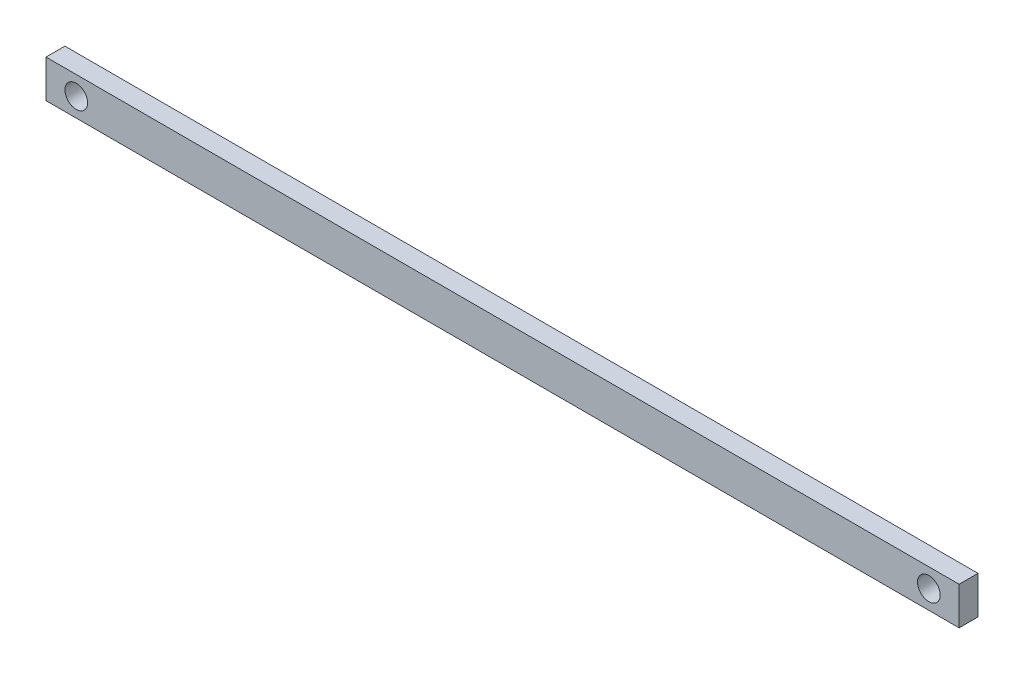
ISO-10303-21;
HEADER;
FILE_DESCRIPTION(('STEP AP214'),'2;1');
FILE_NAME('part.step','',(''),(''),'','','');
FILE_SCHEMA(('AUTOMOTIVE_DESIGN { 1 0 10303 214 1 1 1 1 }'));
ENDSEC;
DATA;
#1=APPLICATION_CONTEXT('core data for automotive mechanical design processes');
#2=APPLICATION_PROTOCOL_DEFINITION('international standard','automotive_design',2000,#1);
#3=PRODUCT_CONTEXT('',#1,'mechanical');
#4=PRODUCT('Part','Part','',(#3));
#5=PRODUCT_RELATED_PRODUCT_CATEGORY('part','',(#4));
#6=PRODUCT_DEFINITION_FORMATION('','',#4);
#7=PRODUCT_DEFINITION_CONTEXT('part definition',#1,'design');
#8=PRODUCT_DEFINITION('design','',#6,#7);
#9=PRODUCT_DEFINITION_SHAPE('','',#8);
#10=(LENGTH_UNIT() NAMED_UNIT(*) SI_UNIT(.MILLI.,.METRE.));
#11=(NAMED_UNIT(*) PLANE_ANGLE_UNIT() SI_UNIT($,.RADIAN.));
#12=(NAMED_UNIT(*) SI_UNIT($,.STERADIAN.) SOLID_ANGLE_UNIT());
#13=UNCERTAINTY_MEASURE_WITH_UNIT(LENGTH_MEASURE(1.E-05),#10,'distance_accuracy_value','');
#14=(GEOMETRIC_REPRESENTATION_CONTEXT(3) GLOBAL_UNCERTAINTY_ASSIGNED_CONTEXT((#13)) GLOBAL_UNIT_ASSIGNED_CONTEXT((#10,
#11,#12)) REPRESENTATION_CONTEXT('',''));
#15=CARTESIAN_POINT('',(0.,0.,0.));
#16=DIRECTION('',(0.,0.,1.));
#17=DIRECTION('',(1.,0.,0.));
#18=AXIS2_PLACEMENT_3D('',#15,#16,#17);
#19=CARTESIAN_POINT('',(0.,0.,25.));
#20=DIRECTION('',(0.,0.,1.));
#21=DIRECTION('',(1.,0.,0.));
#22=AXIS2_PLACEMENT_3D('',#19,#20,#21);
#23=PLANE('',#22);
#24=CARTESIAN_POINT('',(-282.,0.,25.));
#25=DIRECTION('',(0.,0.,1.));
#26=DIRECTION('',(1.,0.,0.));
#27=AXIS2_PLACEMENT_3D('',#24,#25,#26);
#28=CIRCLE('',#27,7.50000000000001);
#29=CARTESIAN_POINT('',(-274.5,0.,25.));
#30=VERTEX_POINT('',#29);
#31=EDGE_CURVE('E110',#30,#30,#28,.T.);
#32=ORIENTED_EDGE('',*,*,#31,.F.);
#33=EDGE_LOOP('',(#32));
#34=FACE_BOUND('',#33,.T.);
#35=DIRECTION('',(0.,1.,0.));
#36=VECTOR('',#35,1.);
#37=CARTESIAN_POINT('',(301.999999999932,12.4999999999979,25.));
#38=LINE('',#37,#36);
#39=CARTESIAN_POINT('',(301.999999999932,-12.5000000000021,25.));
#40=VERTEX_POINT('',#39);
#41=CARTESIAN_POINT('',(301.999999999932,12.4999999999979,25.));
#42=VERTEX_POINT('',#41);
#43=EDGE_CURVE('E108',#40,#42,#38,.T.);
#44=ORIENTED_EDGE('',*,*,#43,.T.);
#45=DIRECTION('',(-1.,0.,0.));
#46=VECTOR('',#45,1.);
#47=CARTESIAN_POINT('',(-302.000000000068,12.4999999999979,25.));
#48=LINE('',#47,#46);
#49=CARTESIAN_POINT('',(-302.000000000068,12.4999999999979,25.));
#50=VERTEX_POINT('',#49);
#51=EDGE_CURVE('E106',#42,#50,#48,.T.);
#52=ORIENTED_EDGE('',*,*,#51,.T.);
#53=DIRECTION('',(0.,-1.,0.));
#54=VECTOR('',#53,1.);
#55=CARTESIAN_POINT('',(-302.000000000068,12.4999999999979,25.));
#56=LINE('',#55,#54);
#57=CARTESIAN_POINT('',(-302.000000000068,-12.5000000000021,25.));
#58=VERTEX_POINT('',#57);
#59=EDGE_CURVE('E96',#50,#58,#56,.T.);
#60=ORIENTED_EDGE('',*,*,#59,.T.);
#61=DIRECTION('',(1.,0.,0.));
#62=VECTOR('',#61,1.);
#63=CARTESIAN_POINT('',(-302.000000000068,-12.5000000000021,25.));
#64=LINE('',#63,#62);
#65=EDGE_CURVE('E62',#58,#40,#64,.T.);
#66=ORIENTED_EDGE('',*,*,#65,.T.);
#67=EDGE_LOOP('',(#44,#52,#60,#66));
#68=FACE_BOUND('',#67,.T.);
#69=CARTESIAN_POINT('',(282.,0.,25.));
#70=DIRECTION('',(0.,0.,1.));
#71=DIRECTION('',(1.,0.,0.));
#72=AXIS2_PLACEMENT_3D('',#69,#70,#71);
#73=CIRCLE('',#72,7.50000000000001);
#74=CARTESIAN_POINT('',(289.5,0.,25.));
#75=VERTEX_POINT('',#74);
#76=EDGE_CURVE('E113',#75,#75,#73,.T.);
#77=ORIENTED_EDGE('',*,*,#76,.F.);
#78=EDGE_LOOP('',(#77));
#79=FACE_BOUND('',#78,.T.);
#80=ADVANCED_FACE('F38',(#34,#68,#79),#23,.T.);
#81=CARTESIAN_POINT('',(301.999999999932,12.4999999999979,25.));
#82=DIRECTION('',(-1.,0.,0.));
#83=DIRECTION('',(0.,0.,1.));
#84=AXIS2_PLACEMENT_3D('',#81,#82,#83);
#85=PLANE('',#84);
#86=DIRECTION('',(0.,0.,-1.));
#87=VECTOR('',#86,1.);
#88=CARTESIAN_POINT('',(301.999999999932,-12.5000000000021,25.));
#89=LINE('',#88,#87);
#90=CARTESIAN_POINT('',(301.999999999932,-12.5000000000021,12.5));
#91=VERTEX_POINT('',#90);
#92=EDGE_CURVE('E99',#40,#91,#89,.T.);
#93=ORIENTED_EDGE('',*,*,#92,.T.);
#94=DIRECTION('',(0.,1.,0.));
#95=VECTOR('',#94,1.);
#96=CARTESIAN_POINT('',(301.999999999932,12.4999999999979,12.5));
#97=LINE('',#96,#95);
#98=CARTESIAN_POINT('',(301.999999999932,12.4999999999979,12.5));
#99=VERTEX_POINT('',#98);
#100=EDGE_CURVE('E54',#91,#99,#97,.T.);
#101=ORIENTED_EDGE('',*,*,#100,.T.);
#102=DIRECTION('',(0.,0.,-1.));
#103=VECTOR('',#102,1.);
#104=CARTESIAN_POINT('',(301.999999999932,12.4999999999979,25.));
#105=LINE('',#104,#103);
#106=EDGE_CURVE('E11',#42,#99,#105,.T.);
#107=ORIENTED_EDGE('',*,*,#106,.F.);
#108=ORIENTED_EDGE('',*,*,#43,.F.);
#109=EDGE_LOOP('',(#93,#101,#107,#108));
#110=FACE_BOUND('',#109,.T.);
#111=ADVANCED_FACE('F40',(#110),#85,.F.);
#112=CARTESIAN_POINT('',(-302.000000000068,12.4999999999979,25.));
#113=DIRECTION('',(0.,-1.,0.));
#114=DIRECTION('',(0.,0.,-1.));
#115=AXIS2_PLACEMENT_3D('',#112,#113,#114);
#116=PLANE('',#115);
#117=ORIENTED_EDGE('',*,*,#106,.T.);
#118=DIRECTION('',(1.,0.,0.));
#119=VECTOR('',#118,1.);
#120=CARTESIAN_POINT('',(-302.000000000068,12.4999999999979,12.5));
#121=LINE('',#120,#119);
#122=CARTESIAN_POINT('',(-302.000000000068,12.4999999999979,12.5));
#123=VERTEX_POINT('',#122);
#124=EDGE_CURVE('E82',#123,#99,#121,.T.);
#125=ORIENTED_EDGE('',*,*,#124,.F.);
#126=DIRECTION('',(0.,0.,-1.));
#127=VECTOR('',#126,1.);
#128=CARTESIAN_POINT('',(-302.000000000068,12.4999999999979,25.));
#129=LINE('',#128,#127);
#130=EDGE_CURVE('E47',#50,#123,#129,.T.);
#131=ORIENTED_EDGE('',*,*,#130,.F.);
#132=ORIENTED_EDGE('',*,*,#51,.F.);
#133=EDGE_LOOP('',(#117,#125,#131,#132));
#134=FACE_BOUND('',#133,.T.);
#135=ADVANCED_FACE('F91',(#134),#116,.F.);
#136=CARTESIAN_POINT('',(-302.000000000068,12.4999999999979,25.));
#137=DIRECTION('',(1.,0.,0.));
#138=DIRECTION('',(0.,0.,-1.));
#139=AXIS2_PLACEMENT_3D('',#136,#137,#138);
#140=PLANE('',#139);
#141=ORIENTED_EDGE('',*,*,#130,.T.);
#142=DIRECTION('',(0.,-1.,0.));
#143=VECTOR('',#142,1.);
#144=CARTESIAN_POINT('',(-302.000000000068,12.4999999999979,12.5));
#145=LINE('',#144,#143);
#146=CARTESIAN_POINT('',(-302.000000000068,-12.5000000000021,12.5));
#147=VERTEX_POINT('',#146);
#148=EDGE_CURVE('E79',#123,#147,#145,.T.);
#149=ORIENTED_EDGE('',*,*,#148,.T.);
#150=DIRECTION('',(0.,0.,-1.));
#151=VECTOR('',#150,1.);
#152=CARTESIAN_POINT('',(-302.000000000068,-12.5000000000021,25.));
#153=LINE('',#152,#151);
#154=EDGE_CURVE('E97',#58,#147,#153,.T.);
#155=ORIENTED_EDGE('',*,*,#154,.F.);
#156=ORIENTED_EDGE('',*,*,#59,.F.);
#157=EDGE_LOOP('',(#141,#149,#155,#156));
#158=FACE_BOUND('',#157,.T.);
#159=ADVANCED_FACE('F95',(#158),#140,.F.);
#160=CARTESIAN_POINT('',(-302.000000000068,-12.5000000000021,25.));
#161=DIRECTION('',(0.,1.,0.));
#162=DIRECTION('',(0.,0.,1.));
#163=AXIS2_PLACEMENT_3D('',#160,#161,#162);
#164=PLANE('',#163);
#165=ORIENTED_EDGE('',*,*,#154,.T.);
#166=DIRECTION('',(1.,0.,0.));
#167=VECTOR('',#166,1.);
#168=CARTESIAN_POINT('',(-302.000000000068,-12.5000000000021,12.5));
#169=LINE('',#168,#167);
#170=EDGE_CURVE('E83',#147,#91,#169,.T.);
#171=ORIENTED_EDGE('',*,*,#170,.T.);
#172=ORIENTED_EDGE('',*,*,#92,.F.);
#173=ORIENTED_EDGE('',*,*,#65,.F.);
#174=EDGE_LOOP('',(#165,#171,#172,#173));
#175=FACE_BOUND('',#174,.T.);
#176=ADVANCED_FACE('F142',(#175),#164,.F.);
#177=CARTESIAN_POINT('',(-282.,0.,25.));
#178=DIRECTION('',(0.,0.,-1.));
#179=DIRECTION('',(-1.,0.,0.));
#180=AXIS2_PLACEMENT_3D('',#177,#178,#179);
#181=CYLINDRICAL_SURFACE('',#180,7.50000000000001);
#182=CARTESIAN_POINT('',(-282.,0.,12.5));
#183=DIRECTION('',(0.,0.,1.));
#184=DIRECTION('',(1.,0.,0.));
#185=AXIS2_PLACEMENT_3D('',#182,#183,#184);
#186=CIRCLE('',#185,7.50000000000001);
#187=CARTESIAN_POINT('',(-274.5,0.,12.5));
#188=VERTEX_POINT('',#187);
#189=EDGE_CURVE('E117',#188,#188,#186,.T.);
#190=ORIENTED_EDGE('',*,*,#189,.F.);
#191=EDGE_LOOP('',(#190));
#192=FACE_BOUND('',#191,.T.);
#193=ORIENTED_EDGE('',*,*,#31,.T.);
#194=EDGE_LOOP('',(#193));
#195=FACE_BOUND('',#194,.T.);
#196=ADVANCED_FACE('F128',(#192,#195),#181,.F.);
#197=CARTESIAN_POINT('',(282.,0.,25.));
#198=DIRECTION('',(0.,0.,-1.));
#199=DIRECTION('',(-1.,0.,0.));
#200=AXIS2_PLACEMENT_3D('',#197,#198,#199);
#201=CYLINDRICAL_SURFACE('',#200,7.50000000000001);
#202=CARTESIAN_POINT('',(282.,0.,12.5));
#203=DIRECTION('',(0.,0.,1.));
#204=DIRECTION('',(1.,0.,0.));
#205=AXIS2_PLACEMENT_3D('',#202,#203,#204);
#206=CIRCLE('',#205,7.50000000000001);
#207=CARTESIAN_POINT('',(289.5,0.,12.5));
#208=VERTEX_POINT('',#207);
#209=EDGE_CURVE('E42',#208,#208,#206,.T.);
#210=ORIENTED_EDGE('',*,*,#209,.F.);
#211=EDGE_LOOP('',(#210));
#212=FACE_BOUND('',#211,.T.);
#213=ORIENTED_EDGE('',*,*,#76,.T.);
#214=EDGE_LOOP('',(#213));
#215=FACE_BOUND('',#214,.T.);
#216=ADVANCED_FACE('F125',(#212,#215),#201,.F.);
#217=CARTESIAN_POINT('',(-302.000000000068,12.4999999999979,12.5));
#218=DIRECTION('',(0.,0.,1.));
#219=DIRECTION('',(1.,0.,0.));
#220=AXIS2_PLACEMENT_3D('',#217,#218,#219);
#221=PLANE('',#220);
#222=ORIENTED_EDGE('',*,*,#189,.T.);
#223=EDGE_LOOP('',(#222));
#224=FACE_BOUND('',#223,.T.);
#225=ORIENTED_EDGE('',*,*,#209,.T.);
#226=EDGE_LOOP('',(#225));
#227=FACE_BOUND('',#226,.T.);
#228=ORIENTED_EDGE('',*,*,#170,.F.);
#229=ORIENTED_EDGE('',*,*,#148,.F.);
#230=ORIENTED_EDGE('',*,*,#124,.T.);
#231=ORIENTED_EDGE('',*,*,#100,.F.);
#232=EDGE_LOOP('',(#228,#229,#230,#231));
#233=FACE_BOUND('',#232,.T.);
#234=ADVANCED_FACE('F81',(#224,#227,#233),#221,.F.);
#235=CLOSED_SHELL('',(#80,#111,#135,#159,#176,#196,#216,#234));
#236=MANIFOLD_SOLID_BREP('B2',#235);
#237=ADVANCED_BREP_SHAPE_REPRESENTATION('',(#18,#236),#14);
#238=SHAPE_DEFINITION_REPRESENTATION(#9,#237);
ENDSEC;
END-ISO-10303-21;
